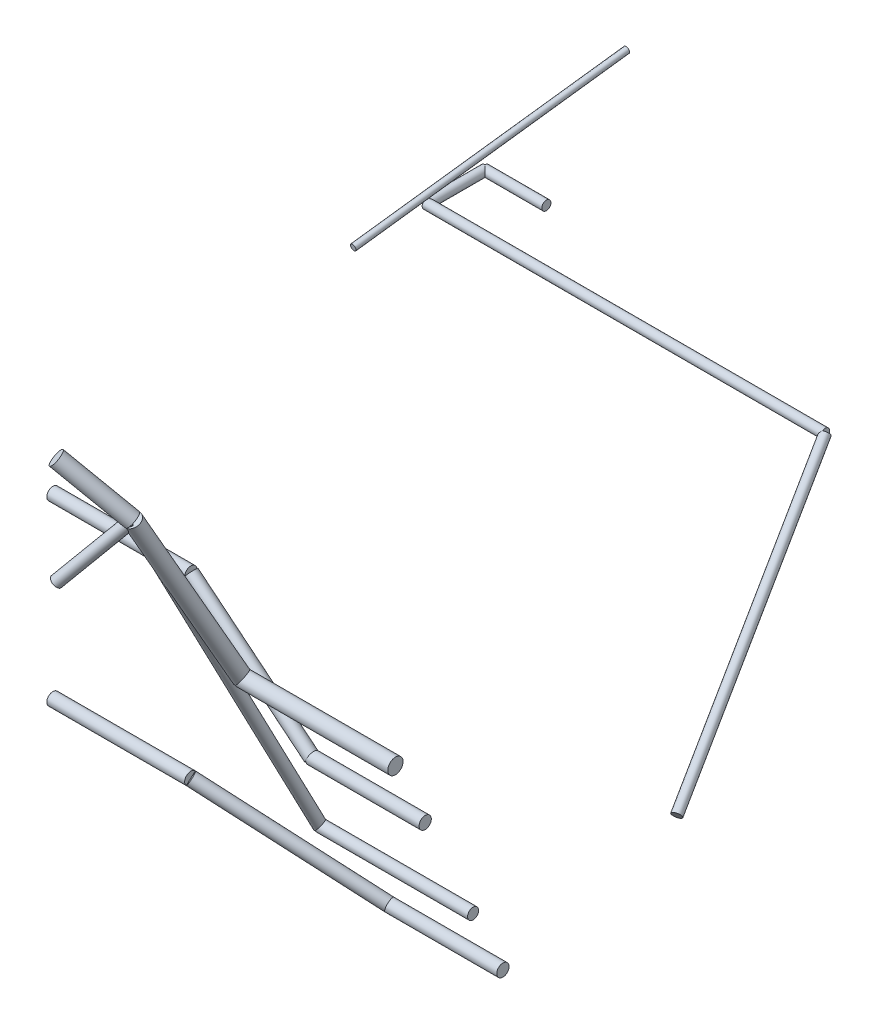
ISO-10303-21;
HEADER;
FILE_DESCRIPTION(('STEP AP214'),'2;1');
FILE_NAME('part.step','',(''),(''),'','','');
FILE_SCHEMA(('AUTOMOTIVE_DESIGN { 1 0 10303 214 1 1 1 1 }'));
ENDSEC;
DATA;
#1=APPLICATION_CONTEXT('core data for automotive mechanical design processes');
#2=APPLICATION_PROTOCOL_DEFINITION('international standard','automotive_design',2000,#1);
#3=PRODUCT_CONTEXT('',#1,'mechanical');
#4=PRODUCT('Part','Part','',(#3));
#5=PRODUCT_RELATED_PRODUCT_CATEGORY('part','',(#4));
#6=PRODUCT_DEFINITION_FORMATION('','',#4);
#7=PRODUCT_DEFINITION_CONTEXT('part definition',#1,'design');
#8=PRODUCT_DEFINITION('design','',#6,#7);
#9=PRODUCT_DEFINITION_SHAPE('','',#8);
#10=(LENGTH_UNIT() NAMED_UNIT(*) SI_UNIT(.MILLI.,.METRE.));
#11=(NAMED_UNIT(*) PLANE_ANGLE_UNIT() SI_UNIT($,.RADIAN.));
#12=(NAMED_UNIT(*) SI_UNIT($,.STERADIAN.) SOLID_ANGLE_UNIT());
#13=UNCERTAINTY_MEASURE_WITH_UNIT(LENGTH_MEASURE(1.E-05),#10,'distance_accuracy_value','');
#14=(GEOMETRIC_REPRESENTATION_CONTEXT(3) GLOBAL_UNCERTAINTY_ASSIGNED_CONTEXT((#13)) GLOBAL_UNIT_ASSIGNED_CONTEXT((#10,
#11,#12)) REPRESENTATION_CONTEXT('',''));
#15=CARTESIAN_POINT('',(0.,0.,0.));
#16=DIRECTION('',(0.,0.,1.));
#17=DIRECTION('',(1.,0.,0.));
#18=AXIS2_PLACEMENT_3D('',#15,#16,#17);
#19=CARTESIAN_POINT('',(-98.,-66.4208,82.229));
#20=DIRECTION('',(-1.,0.,0.));
#21=DIRECTION('',(0.,0.,1.));
#22=AXIS2_PLACEMENT_3D('',#19,#20,#21);
#23=PLANE('',#22);
#24=CARTESIAN_POINT('',(-98.,-66.4208,82.229));
#25=DIRECTION('',(1.,0.,0.));
#26=DIRECTION('',(0.,0.,-1.));
#27=AXIS2_PLACEMENT_3D('',#24,#25,#26);
#28=CIRCLE('',#27,2.5);
#29=CARTESIAN_POINT('',(-98.,-66.4208,79.729));
#30=VERTEX_POINT('',#29);
#31=EDGE_CURVE('P0_E10',#30,#30,#28,.T.);
#32=ORIENTED_EDGE('',*,*,#31,.F.);
#33=EDGE_LOOP('',(#32));
#34=FACE_BOUND('',#33,.T.);
#35=ADVANCED_FACE('P0_F15',(#34),#23,.T.);
#36=CARTESIAN_POINT('',(-48.,-66.4208,82.229));
#37=DIRECTION('',(1.,0.,0.));
#38=DIRECTION('',(0.,0.,-1.));
#39=AXIS2_PLACEMENT_3D('',#36,#37,#38);
#40=PLANE('',#39);
#41=CARTESIAN_POINT('',(-48.,-66.4208,82.229));
#42=DIRECTION('',(-1.,0.,0.));
#43=DIRECTION('',(0.,0.,1.));
#44=AXIS2_PLACEMENT_3D('',#41,#42,#43);
#45=CIRCLE('',#44,2.5);
#46=CARTESIAN_POINT('',(-48.,-66.4208,84.729));
#47=VERTEX_POINT('',#46);
#48=EDGE_CURVE('P0_E22',#47,#47,#45,.T.);
#49=ORIENTED_EDGE('',*,*,#48,.F.);
#50=EDGE_LOOP('',(#49));
#51=FACE_BOUND('',#50,.T.);
#52=ADVANCED_FACE('P0_F26',(#51),#40,.T.);
#53=CARTESIAN_POINT('',(-48.,-66.4208,82.229));
#54=DIRECTION('',(-1.,0.,0.));
#55=DIRECTION('',(0.,0.,1.));
#56=AXIS2_PLACEMENT_3D('',#53,#54,#55);
#57=CYLINDRICAL_SURFACE('',#56,2.5);
#58=ORIENTED_EDGE('',*,*,#31,.T.);
#59=EDGE_LOOP('',(#58));
#60=FACE_BOUND('',#59,.T.);
#61=ORIENTED_EDGE('',*,*,#48,.T.);
#62=EDGE_LOOP('',(#61));
#63=FACE_BOUND('',#62,.T.);
#64=ADVANCED_FACE('P0_F17',(#60,#63),#57,.T.);
#65=CLOSED_SHELL('',(#35,#52,#64));
#66=MANIFOLD_SOLID_BREP('P0_B1',#65);
#67=CARTESIAN_POINT('',(-104.,-10.,112.));
#68=DIRECTION('',(-0.0936401114906505,0.880541667065283,0.46462662653136));
#69=DIRECTION('',(0.,-0.466677153849027,0.884427743840825));
#70=AXIS2_PLACEMENT_3D('',#67,#68,#69);
#71=PLANE('',#70);
#72=CARTESIAN_POINT('',(-104.,-10.,112.));
#73=DIRECTION('',(0.0936401114906505,-0.880541667065283,-0.46462662653136));
#74=DIRECTION('',(0.,0.466677153849027,-0.884427743840825));
#75=AXIS2_PLACEMENT_3D('',#72,#73,#74);
#76=CIRCLE('',#75,2.5);
#77=CARTESIAN_POINT('',(-104.,-8.83330711537744,109.788930640398));
#78=VERTEX_POINT('',#77);
#79=EDGE_CURVE('P1_E10',#78,#78,#76,.T.);
#80=ORIENTED_EDGE('',*,*,#79,.F.);
#81=EDGE_LOOP('',(#80));
#82=FACE_BOUND('',#81,.T.);
#83=ADVANCED_FACE('P1_F15',(#82),#71,.T.);
#84=CARTESIAN_POINT('',(-98.,-66.4208,82.229));
#85=DIRECTION('',(0.0936401114906505,-0.880541667065283,-0.46462662653136));
#86=DIRECTION('',(0.,0.466677153849027,-0.884427743840825));
#87=AXIS2_PLACEMENT_3D('',#84,#85,#86);
#88=PLANE('',#87);
#89=CARTESIAN_POINT('',(-98.,-66.4208,82.229));
#90=DIRECTION('',(-0.0936401114906505,0.880541667065283,0.46462662653136));
#91=DIRECTION('',(0.,-0.466677153849027,0.884427743840825));
#92=AXIS2_PLACEMENT_3D('',#89,#90,#91);
#93=CIRCLE('',#92,2.5);
#94=CARTESIAN_POINT('',(-98.,-67.5874928846226,84.4400693596021));
#95=VERTEX_POINT('',#94);
#96=EDGE_CURVE('P1_E22',#95,#95,#93,.T.);
#97=ORIENTED_EDGE('',*,*,#96,.F.);
#98=EDGE_LOOP('',(#97));
#99=FACE_BOUND('',#98,.T.);
#100=ADVANCED_FACE('P1_F26',(#99),#88,.T.);
#101=CARTESIAN_POINT('',(-98.,-66.4208,82.229));
#102=DIRECTION('',(-0.0936401114906505,0.880541667065283,0.46462662653136));
#103=DIRECTION('',(0.,-0.466677153849027,0.884427743840825));
#104=AXIS2_PLACEMENT_3D('',#101,#102,#103);
#105=CYLINDRICAL_SURFACE('',#104,2.5);
#106=ORIENTED_EDGE('',*,*,#79,.T.);
#107=EDGE_LOOP('',(#106));
#108=FACE_BOUND('',#107,.T.);
#109=ORIENTED_EDGE('',*,*,#96,.T.);
#110=EDGE_LOOP('',(#109));
#111=FACE_BOUND('',#110,.T.);
#112=ADVANCED_FACE('P1_F17',(#108,#111),#105,.T.);
#113=CLOSED_SHELL('',(#83,#100,#112));
#114=MANIFOLD_SOLID_BREP('P1_B1',#113);
#115=CARTESIAN_POINT('',(-119.,5.,121.9));
#116=DIRECTION('',(-0.640762396942007,0.640762396942007,0.422903181981725));
#117=DIRECTION('',(-0.707106781186548,-0.707106781186548,0.));
#118=AXIS2_PLACEMENT_3D('',#115,#116,#117);
#119=PLANE('',#118);
#120=CARTESIAN_POINT('',(-119.,5.,121.9));
#121=DIRECTION('',(0.640762396942007,-0.640762396942007,-0.422903181981725));
#122=DIRECTION('',(0.707106781186548,0.707106781186548,0.));
#123=AXIS2_PLACEMENT_3D('',#120,#121,#122);
#124=CIRCLE('',#123,2.5);
#125=CARTESIAN_POINT('',(-117.232233047034,6.76776695296637,121.9));
#126=VERTEX_POINT('',#125);
#127=EDGE_CURVE('P2_E10',#126,#126,#124,.T.);
#128=ORIENTED_EDGE('',*,*,#127,.F.);
#129=EDGE_LOOP('',(#128));
#130=FACE_BOUND('',#129,.T.);
#131=ADVANCED_FACE('P2_F15',(#130),#119,.T.);
#132=CARTESIAN_POINT('',(-104.,-10.,112.));
#133=DIRECTION('',(0.640762396942007,-0.640762396942007,-0.422903181981725));
#134=DIRECTION('',(0.707106781186548,0.707106781186548,0.));
#135=AXIS2_PLACEMENT_3D('',#132,#133,#134);
#136=PLANE('',#135);
#137=CARTESIAN_POINT('',(-104.,-10.,112.));
#138=DIRECTION('',(-0.640762396942007,0.640762396942007,0.422903181981725));
#139=DIRECTION('',(-0.707106781186548,-0.707106781186548,0.));
#140=AXIS2_PLACEMENT_3D('',#137,#138,#139);
#141=CIRCLE('',#140,2.5);
#142=CARTESIAN_POINT('',(-105.767766952966,-11.7677669529664,112.));
#143=VERTEX_POINT('',#142);
#144=EDGE_CURVE('P2_E22',#143,#143,#141,.T.);
#145=ORIENTED_EDGE('',*,*,#144,.F.);
#146=EDGE_LOOP('',(#145));
#147=FACE_BOUND('',#146,.T.);
#148=ADVANCED_FACE('P2_F26',(#147),#136,.T.);
#149=CARTESIAN_POINT('',(-104.,-10.,112.));
#150=DIRECTION('',(-0.640762396942007,0.640762396942007,0.422903181981725));
#151=DIRECTION('',(-0.707106781186548,-0.707106781186548,0.));
#152=AXIS2_PLACEMENT_3D('',#149,#150,#151);
#153=CYLINDRICAL_SURFACE('',#152,2.5);
#154=ORIENTED_EDGE('',*,*,#127,.T.);
#155=EDGE_LOOP('',(#154));
#156=FACE_BOUND('',#155,.T.);
#157=ORIENTED_EDGE('',*,*,#144,.T.);
#158=EDGE_LOOP('',(#157));
#159=FACE_BOUND('',#158,.T.);
#160=ADVANCED_FACE('P2_F17',(#156,#159),#153,.T.);
#161=CLOSED_SHELL('',(#131,#148,#160));
#162=MANIFOLD_SOLID_BREP('P2_B1',#161);
#163=CARTESIAN_POINT('',(-98.,-120.7992,56.8719));
#164=DIRECTION('',(-1.,0.,0.));
#165=DIRECTION('',(0.,0.,1.));
#166=AXIS2_PLACEMENT_3D('',#163,#164,#165);
#167=PLANE('',#166);
#168=CARTESIAN_POINT('',(-98.,-120.7992,56.8719));
#169=DIRECTION('',(1.,0.,0.));
#170=DIRECTION('',(0.,0.,-1.));
#171=AXIS2_PLACEMENT_3D('',#168,#169,#170);
#172=CIRCLE('',#171,1.8);
#173=CARTESIAN_POINT('',(-98.,-120.7992,55.0719));
#174=VERTEX_POINT('',#173);
#175=EDGE_CURVE('P3_E10',#174,#174,#172,.T.);
#176=ORIENTED_EDGE('',*,*,#175,.F.);
#177=EDGE_LOOP('',(#176));
#178=FACE_BOUND('',#177,.T.);
#179=ADVANCED_FACE('P3_F15',(#178),#167,.T.);
#180=CARTESIAN_POINT('',(-48.,-120.7992,56.8719));
#181=DIRECTION('',(1.,0.,0.));
#182=DIRECTION('',(0.,0.,-1.));
#183=AXIS2_PLACEMENT_3D('',#180,#181,#182);
#184=PLANE('',#183);
#185=CARTESIAN_POINT('',(-48.,-120.7992,56.8719));
#186=DIRECTION('',(-1.,0.,0.));
#187=DIRECTION('',(0.,0.,1.));
#188=AXIS2_PLACEMENT_3D('',#185,#186,#187);
#189=CIRCLE('',#188,1.8);
#190=CARTESIAN_POINT('',(-48.,-120.7992,58.6719));
#191=VERTEX_POINT('',#190);
#192=EDGE_CURVE('P3_E22',#191,#191,#189,.T.);
#193=ORIENTED_EDGE('',*,*,#192,.F.);
#194=EDGE_LOOP('',(#193));
#195=FACE_BOUND('',#194,.T.);
#196=ADVANCED_FACE('P3_F26',(#195),#184,.T.);
#197=CARTESIAN_POINT('',(-48.,-120.7992,56.8719));
#198=DIRECTION('',(-1.,0.,0.));
#199=DIRECTION('',(0.,0.,1.));
#200=AXIS2_PLACEMENT_3D('',#197,#198,#199);
#201=CYLINDRICAL_SURFACE('',#200,1.8);
#202=ORIENTED_EDGE('',*,*,#175,.T.);
#203=EDGE_LOOP('',(#202));
#204=FACE_BOUND('',#203,.T.);
#205=ORIENTED_EDGE('',*,*,#192,.T.);
#206=EDGE_LOOP('',(#205));
#207=FACE_BOUND('',#206,.T.);
#208=ADVANCED_FACE('P3_F17',(#204,#207),#201,.T.);
#209=CLOSED_SHELL('',(#179,#196,#208));
#210=MANIFOLD_SOLID_BREP('P3_B1',#209);
#211=CARTESIAN_POINT('',(-104.,-9.99999999999999,112.));
#212=DIRECTION('',(-0.0484255821067293,0.894252626159987,0.444935055489664));
#213=DIRECTION('',(0.,-0.445457669415632,0.895303001647372));
#214=AXIS2_PLACEMENT_3D('',#211,#212,#213);
#215=PLANE('',#214);
#216=CARTESIAN_POINT('',(-104.,-9.99999999999999,112.));
#217=DIRECTION('',(0.0484255821067293,-0.894252626159987,-0.444935055489664));
#218=DIRECTION('',(0.,0.445457669415632,-0.895303001647372));
#219=AXIS2_PLACEMENT_3D('',#216,#217,#218);
#220=CIRCLE('',#219,1.8);
#221=CARTESIAN_POINT('',(-104.,-9.19817619505186,110.388454597035));
#222=VERTEX_POINT('',#221);
#223=EDGE_CURVE('P4_E10',#222,#222,#220,.T.);
#224=ORIENTED_EDGE('',*,*,#223,.F.);
#225=EDGE_LOOP('',(#224));
#226=FACE_BOUND('',#225,.T.);
#227=ADVANCED_FACE('P4_F15',(#226),#215,.T.);
#228=CARTESIAN_POINT('',(-98.,-120.7992,56.8719));
#229=DIRECTION('',(0.0484255821067293,-0.894252626159987,-0.444935055489664));
#230=DIRECTION('',(0.,0.445457669415632,-0.895303001647372));
#231=AXIS2_PLACEMENT_3D('',#228,#229,#230);
#232=PLANE('',#231);
#233=CARTESIAN_POINT('',(-98.,-120.7992,56.8719));
#234=DIRECTION('',(-0.0484255821067293,0.894252626159987,0.444935055489664));
#235=DIRECTION('',(0.,-0.445457669415632,0.895303001647372));
#236=AXIS2_PLACEMENT_3D('',#233,#234,#235);
#237=CIRCLE('',#236,1.8);
#238=CARTESIAN_POINT('',(-98.,-121.601023804948,58.4834454029653));
#239=VERTEX_POINT('',#238);
#240=EDGE_CURVE('P4_E22',#239,#239,#237,.T.);
#241=ORIENTED_EDGE('',*,*,#240,.F.);
#242=EDGE_LOOP('',(#241));
#243=FACE_BOUND('',#242,.T.);
#244=ADVANCED_FACE('P4_F26',(#243),#232,.T.);
#245=CARTESIAN_POINT('',(-98.,-120.7992,56.8719));
#246=DIRECTION('',(-0.0484255821067293,0.894252626159987,0.444935055489664));
#247=DIRECTION('',(0.,-0.445457669415632,0.895303001647372));
#248=AXIS2_PLACEMENT_3D('',#245,#246,#247);
#249=CYLINDRICAL_SURFACE('',#248,1.8);
#250=ORIENTED_EDGE('',*,*,#223,.T.);
#251=EDGE_LOOP('',(#250));
#252=FACE_BOUND('',#251,.T.);
#253=ORIENTED_EDGE('',*,*,#240,.T.);
#254=EDGE_LOOP('',(#253));
#255=FACE_BOUND('',#254,.T.);
#256=ADVANCED_FACE('P4_F17',(#252,#255),#249,.T.);
#257=CLOSED_SHELL('',(#227,#244,#256));
#258=MANIFOLD_SOLID_BREP('P4_B1',#257);
#259=CARTESIAN_POINT('',(-119.,-30.,121.9));
#260=DIRECTION('',(-0.557852144593892,-0.743802859458523,0.368182415431969));
#261=DIRECTION('',(0.8,-0.6,0.));
#262=AXIS2_PLACEMENT_3D('',#259,#260,#261);
#263=PLANE('',#262);
#264=CARTESIAN_POINT('',(-119.,-30.,121.9));
#265=DIRECTION('',(0.557852144593892,0.743802859458523,-0.368182415431969));
#266=DIRECTION('',(-0.8,0.6,0.));
#267=AXIS2_PLACEMENT_3D('',#264,#265,#266);
#268=CIRCLE('',#267,1.8);
#269=CARTESIAN_POINT('',(-120.44,-28.92,121.9));
#270=VERTEX_POINT('',#269);
#271=EDGE_CURVE('P5_E10',#270,#270,#268,.T.);
#272=ORIENTED_EDGE('',*,*,#271,.F.);
#273=EDGE_LOOP('',(#272));
#274=FACE_BOUND('',#273,.T.);
#275=ADVANCED_FACE('P5_F15',(#274),#263,.T.);
#276=CARTESIAN_POINT('',(-104.,-10.,112.));
#277=DIRECTION('',(0.557852144593892,0.743802859458523,-0.368182415431969));
#278=DIRECTION('',(-0.8,0.6,0.));
#279=AXIS2_PLACEMENT_3D('',#276,#277,#278);
#280=PLANE('',#279);
#281=CARTESIAN_POINT('',(-104.,-10.,112.));
#282=DIRECTION('',(-0.557852144593892,-0.743802859458523,0.368182415431969));
#283=DIRECTION('',(0.8,-0.6,0.));
#284=AXIS2_PLACEMENT_3D('',#281,#282,#283);
#285=CIRCLE('',#284,1.8);
#286=CARTESIAN_POINT('',(-102.56,-11.08,112.));
#287=VERTEX_POINT('',#286);
#288=EDGE_CURVE('P5_E22',#287,#287,#285,.T.);
#289=ORIENTED_EDGE('',*,*,#288,.F.);
#290=EDGE_LOOP('',(#289));
#291=FACE_BOUND('',#290,.T.);
#292=ADVANCED_FACE('P5_F26',(#291),#280,.T.);
#293=CARTESIAN_POINT('',(-104.,-10.,112.));
#294=DIRECTION('',(-0.557852144593892,-0.743802859458523,0.368182415431969));
#295=DIRECTION('',(0.8,-0.6,0.));
#296=AXIS2_PLACEMENT_3D('',#293,#294,#295);
#297=CYLINDRICAL_SURFACE('',#296,1.8);
#298=ORIENTED_EDGE('',*,*,#271,.T.);
#299=EDGE_LOOP('',(#298));
#300=FACE_BOUND('',#299,.T.);
#301=ORIENTED_EDGE('',*,*,#288,.T.);
#302=EDGE_LOOP('',(#301));
#303=FACE_BOUND('',#302,.T.);
#304=ADVANCED_FACE('P5_F17',(#300,#303),#297,.T.);
#305=CLOSED_SHELL('',(#275,#292,#304));
#306=MANIFOLD_SOLID_BREP('P5_B1',#305);
#307=CARTESIAN_POINT('',(-65.,70.4055,36.));
#308=DIRECTION('',(-1.,0.,0.));
#309=DIRECTION('',(0.,0.,1.));
#310=AXIS2_PLACEMENT_3D('',#307,#308,#309);
#311=PLANE('',#310);
#312=CARTESIAN_POINT('',(-65.,70.4055,36.));
#313=DIRECTION('',(1.,0.,0.));
#314=DIRECTION('',(0.,0.,-1.));
#315=AXIS2_PLACEMENT_3D('',#312,#313,#314);
#316=CIRCLE('',#315,1.5);
#317=CARTESIAN_POINT('',(-65.,70.4055,34.5));
#318=VERTEX_POINT('',#317);
#319=EDGE_CURVE('P6_E10',#318,#318,#316,.T.);
#320=ORIENTED_EDGE('',*,*,#319,.F.);
#321=EDGE_LOOP('',(#320));
#322=FACE_BOUND('',#321,.T.);
#323=ADVANCED_FACE('P6_F15',(#322),#311,.T.);
#324=CARTESIAN_POINT('',(-44.972,70.4055,36.));
#325=DIRECTION('',(1.,0.,0.));
#326=DIRECTION('',(0.,0.,-1.));
#327=AXIS2_PLACEMENT_3D('',#324,#325,#326);
#328=PLANE('',#327);
#329=CARTESIAN_POINT('',(-44.972,70.4055,36.));
#330=DIRECTION('',(-1.,0.,0.));
#331=DIRECTION('',(0.,0.,1.));
#332=AXIS2_PLACEMENT_3D('',#329,#330,#331);
#333=CIRCLE('',#332,1.5);
#334=CARTESIAN_POINT('',(-44.972,70.4055,37.5));
#335=VERTEX_POINT('',#334);
#336=EDGE_CURVE('P6_E22',#335,#335,#333,.T.);
#337=ORIENTED_EDGE('',*,*,#336,.F.);
#338=EDGE_LOOP('',(#337));
#339=FACE_BOUND('',#338,.T.);
#340=ADVANCED_FACE('P6_F26',(#339),#328,.T.);
#341=CARTESIAN_POINT('',(-44.972,70.4055,36.));
#342=DIRECTION('',(-1.,0.,0.));
#343=DIRECTION('',(0.,0.,1.));
#344=AXIS2_PLACEMENT_3D('',#341,#342,#343);
#345=CYLINDRICAL_SURFACE('',#344,1.5);
#346=ORIENTED_EDGE('',*,*,#319,.T.);
#347=EDGE_LOOP('',(#346));
#348=FACE_BOUND('',#347,.T.);
#349=ORIENTED_EDGE('',*,*,#336,.T.);
#350=EDGE_LOOP('',(#349));
#351=FACE_BOUND('',#350,.T.);
#352=ADVANCED_FACE('P6_F17',(#348,#351),#345,.T.);
#353=CLOSED_SHELL('',(#323,#340,#352));
#354=MANIFOLD_SOLID_BREP('P6_B1',#353);
#355=CARTESIAN_POINT('',(-65.,70.4055,55.));
#356=DIRECTION('',(0.,0.,1.));
#357=DIRECTION('',(1.,0.,0.));
#358=AXIS2_PLACEMENT_3D('',#355,#356,#357);
#359=PLANE('',#358);
#360=CARTESIAN_POINT('',(-65.,70.4055,55.));
#361=DIRECTION('',(0.,0.,-1.));
#362=DIRECTION('',(-1.,0.,0.));
#363=AXIS2_PLACEMENT_3D('',#360,#361,#362);
#364=CIRCLE('',#363,1.5);
#365=CARTESIAN_POINT('',(-66.5,70.4055,55.));
#366=VERTEX_POINT('',#365);
#367=EDGE_CURVE('P7_E10',#366,#366,#364,.T.);
#368=ORIENTED_EDGE('',*,*,#367,.F.);
#369=EDGE_LOOP('',(#368));
#370=FACE_BOUND('',#369,.T.);
#371=ADVANCED_FACE('P7_F15',(#370),#359,.T.);
#372=CARTESIAN_POINT('',(-65.,70.4055,36.));
#373=DIRECTION('',(0.,0.,-1.));
#374=DIRECTION('',(-1.,0.,0.));
#375=AXIS2_PLACEMENT_3D('',#372,#373,#374);
#376=PLANE('',#375);
#377=CARTESIAN_POINT('',(-65.,70.4055,36.));
#378=DIRECTION('',(0.,0.,1.));
#379=DIRECTION('',(1.,0.,0.));
#380=AXIS2_PLACEMENT_3D('',#377,#378,#379);
#381=CIRCLE('',#380,1.5);
#382=CARTESIAN_POINT('',(-63.5,70.4055,36.));
#383=VERTEX_POINT('',#382);
#384=EDGE_CURVE('P7_E22',#383,#383,#381,.T.);
#385=ORIENTED_EDGE('',*,*,#384,.F.);
#386=EDGE_LOOP('',(#385));
#387=FACE_BOUND('',#386,.T.);
#388=ADVANCED_FACE('P7_F26',(#387),#376,.T.);
#389=CARTESIAN_POINT('',(-65.,70.4055,36.));
#390=DIRECTION('',(0.,0.,1.));
#391=DIRECTION('',(1.,0.,0.));
#392=AXIS2_PLACEMENT_3D('',#389,#390,#391);
#393=CYLINDRICAL_SURFACE('',#392,1.5);
#394=ORIENTED_EDGE('',*,*,#367,.T.);
#395=EDGE_LOOP('',(#394));
#396=FACE_BOUND('',#395,.T.);
#397=ORIENTED_EDGE('',*,*,#384,.T.);
#398=EDGE_LOOP('',(#397));
#399=FACE_BOUND('',#398,.T.);
#400=ADVANCED_FACE('P7_F17',(#396,#399),#393,.T.);
#401=CLOSED_SHELL('',(#371,#388,#400));
#402=MANIFOLD_SOLID_BREP('P7_B1',#401);
#403=CARTESIAN_POINT('',(65.,70.4055,55.));
#404=DIRECTION('',(1.,0.,0.));
#405=DIRECTION('',(0.,0.,-1.));
#406=AXIS2_PLACEMENT_3D('',#403,#404,#405);
#407=PLANE('',#406);
#408=CARTESIAN_POINT('',(65.,70.4055,55.));
#409=DIRECTION('',(-1.,0.,0.));
#410=DIRECTION('',(0.,0.,1.));
#411=AXIS2_PLACEMENT_3D('',#408,#409,#410);
#412=CIRCLE('',#411,1.5);
#413=CARTESIAN_POINT('',(65.,70.4055,56.5));
#414=VERTEX_POINT('',#413);
#415=EDGE_CURVE('P8_E10',#414,#414,#412,.T.);
#416=ORIENTED_EDGE('',*,*,#415,.F.);
#417=EDGE_LOOP('',(#416));
#418=FACE_BOUND('',#417,.T.);
#419=ADVANCED_FACE('P8_F15',(#418),#407,.T.);
#420=CARTESIAN_POINT('',(-65.,70.4055,55.));
#421=DIRECTION('',(-1.,0.,0.));
#422=DIRECTION('',(0.,0.,1.));
#423=AXIS2_PLACEMENT_3D('',#420,#421,#422);
#424=PLANE('',#423);
#425=CARTESIAN_POINT('',(-65.,70.4055,55.));
#426=DIRECTION('',(1.,0.,0.));
#427=DIRECTION('',(0.,0.,-1.));
#428=AXIS2_PLACEMENT_3D('',#425,#426,#427);
#429=CIRCLE('',#428,1.5);
#430=CARTESIAN_POINT('',(-65.,70.4055,53.5));
#431=VERTEX_POINT('',#430);
#432=EDGE_CURVE('P8_E22',#431,#431,#429,.T.);
#433=ORIENTED_EDGE('',*,*,#432,.F.);
#434=EDGE_LOOP('',(#433));
#435=FACE_BOUND('',#434,.T.);
#436=ADVANCED_FACE('P8_F26',(#435),#424,.T.);
#437=CARTESIAN_POINT('',(-65.,70.4055,55.));
#438=DIRECTION('',(1.,0.,0.));
#439=DIRECTION('',(0.,0.,-1.));
#440=AXIS2_PLACEMENT_3D('',#437,#438,#439);
#441=CYLINDRICAL_SURFACE('',#440,1.5);
#442=ORIENTED_EDGE('',*,*,#415,.T.);
#443=EDGE_LOOP('',(#442));
#444=FACE_BOUND('',#443,.T.);
#445=ORIENTED_EDGE('',*,*,#432,.T.);
#446=EDGE_LOOP('',(#445));
#447=FACE_BOUND('',#446,.T.);
#448=ADVANCED_FACE('P8_F17',(#444,#447),#441,.T.);
#449=CLOSED_SHELL('',(#419,#436,#448));
#450=MANIFOLD_SOLID_BREP('P8_B1',#449);
#451=CARTESIAN_POINT('',(95.,16.717,133.4));
#452=DIRECTION('',(0.301070476982569,-0.538800743449288,0.786797513181113));
#453=DIRECTION('',(0.,-0.825079648031157,-0.565016437287255));
#454=AXIS2_PLACEMENT_3D('',#451,#452,#453);
#455=PLANE('',#454);
#456=CARTESIAN_POINT('',(95.,16.717,133.4));
#457=DIRECTION('',(-0.301070476982569,0.538800743449288,-0.786797513181113));
#458=DIRECTION('',(0.,0.825079648031157,0.565016437287255));
#459=AXIS2_PLACEMENT_3D('',#456,#457,#458);
#460=CIRCLE('',#459,1.5);
#461=CARTESIAN_POINT('',(95.,17.9546194720467,134.247524655931));
#462=VERTEX_POINT('',#461);
#463=EDGE_CURVE('P9_E10',#462,#462,#460,.T.);
#464=ORIENTED_EDGE('',*,*,#463,.F.);
#465=EDGE_LOOP('',(#464));
#466=FACE_BOUND('',#465,.T.);
#467=ADVANCED_FACE('P9_F15',(#466),#455,.T.);
#468=CARTESIAN_POINT('',(65.,70.4055,55.));
#469=DIRECTION('',(-0.301070476982569,0.538800743449288,-0.786797513181113));
#470=DIRECTION('',(0.,0.825079648031157,0.565016437287255));
#471=AXIS2_PLACEMENT_3D('',#468,#469,#470);
#472=PLANE('',#471);
#473=CARTESIAN_POINT('',(65.,70.4055,55.));
#474=DIRECTION('',(0.301070476982569,-0.538800743449288,0.786797513181113));
#475=DIRECTION('',(0.,-0.825079648031157,-0.565016437287255));
#476=AXIS2_PLACEMENT_3D('',#473,#474,#475);
#477=CIRCLE('',#476,1.5);
#478=CARTESIAN_POINT('',(65.,69.1678805279533,54.1524753440691));
#479=VERTEX_POINT('',#478);
#480=EDGE_CURVE('P9_E22',#479,#479,#477,.T.);
#481=ORIENTED_EDGE('',*,*,#480,.F.);
#482=EDGE_LOOP('',(#481));
#483=FACE_BOUND('',#482,.T.);
#484=ADVANCED_FACE('P9_F26',(#483),#472,.T.);
#485=CARTESIAN_POINT('',(65.,70.4055,55.));
#486=DIRECTION('',(0.301070476982569,-0.538800743449288,0.786797513181113));
#487=DIRECTION('',(0.,-0.825079648031157,-0.565016437287255));
#488=AXIS2_PLACEMENT_3D('',#485,#486,#487);
#489=CYLINDRICAL_SURFACE('',#488,1.5);
#490=ORIENTED_EDGE('',*,*,#463,.T.);
#491=EDGE_LOOP('',(#490));
#492=FACE_BOUND('',#491,.T.);
#493=ORIENTED_EDGE('',*,*,#480,.T.);
#494=EDGE_LOOP('',(#493));
#495=FACE_BOUND('',#494,.T.);
#496=ADVANCED_FACE('P9_F17',(#492,#495),#489,.T.);
#497=CLOSED_SHELL('',(#467,#484,#496));
#498=MANIFOLD_SOLID_BREP('P9_B1',#497);
#499=CARTESIAN_POINT('',(-25.,110.,119.));
#500=DIRECTION('',(-0.0739691676467034,-0.206361340967482,0.975675949888976));
#501=DIRECTION('',(0.,-0.978356128357743,-0.206928214859279));
#502=AXIS2_PLACEMENT_3D('',#499,#500,#501);
#503=PLANE('',#502);
#504=CARTESIAN_POINT('',(-25.,110.,119.));
#505=DIRECTION('',(0.0739691676467034,0.206361340967482,-0.975675949888976));
#506=DIRECTION('',(0.,0.978356128357743,0.206928214859279));
#507=AXIS2_PLACEMENT_3D('',#504,#505,#506);
#508=CIRCLE('',#507,1.);
#509=CARTESIAN_POINT('',(-25.,109.021643871642,118.793071785141));
#510=VERTEX_POINT('',#509);
#511=EDGE_CURVE('P10_E10',#510,#510,#508,.T.);
#512=ORIENTED_EDGE('',*,*,#511,.F.);
#513=EDGE_LOOP('',(#512));
#514=FACE_BOUND('',#513,.T.);
#515=ADVANCED_FACE('P10_F15',(#514),#503,.T.);
#516=CARTESIAN_POINT('',(-18.7075,127.555,36.));
#517=DIRECTION('',(0.0739691676467034,0.206361340967482,-0.975675949888976));
#518=DIRECTION('',(0.,0.978356128357743,0.206928214859279));
#519=AXIS2_PLACEMENT_3D('',#516,#517,#518);
#520=PLANE('',#519);
#521=CARTESIAN_POINT('',(-18.7075,127.555,36.));
#522=DIRECTION('',(-0.0739691676467034,-0.206361340967482,0.975675949888976));
#523=DIRECTION('',(0.,-0.978356128357743,-0.206928214859279));
#524=AXIS2_PLACEMENT_3D('',#521,#522,#523);
#525=CIRCLE('',#524,1.);
#526=CARTESIAN_POINT('',(-18.7075,126.576643871642,35.7930717851407));
#527=VERTEX_POINT('',#526);
#528=EDGE_CURVE('P10_E22',#527,#527,#525,.T.);
#529=ORIENTED_EDGE('',*,*,#528,.F.);
#530=EDGE_LOOP('',(#529));
#531=FACE_BOUND('',#530,.T.);
#532=ADVANCED_FACE('P10_F26',(#531),#520,.T.);
#533=CARTESIAN_POINT('',(-18.7075,127.555,36.));
#534=DIRECTION('',(-0.0739691676467034,-0.206361340967482,0.975675949888976));
#535=DIRECTION('',(0.,-0.978356128357743,-0.206928214859279));
#536=AXIS2_PLACEMENT_3D('',#533,#534,#535);
#537=CYLINDRICAL_SURFACE('',#536,1.);
#538=CARTESIAN_POINT('',(-25.,109.021643871642,118.793071785141));
#539=CARTESIAN_POINT('',(-24.934453125,109.204508454976,117.928488451807));
#540=CARTESIAN_POINT('',(-24.86890625,109.387373038309,117.063905118474));
#541=CARTESIAN_POINT('',(-24.7378125,109.753102204976,115.334738451807));
#542=CARTESIAN_POINT('',(-24.672265625,109.935966788309,114.470155118474));
#543=CARTESIAN_POINT('',(-24.541171875,110.301695954976,112.740988451807));
#544=CARTESIAN_POINT('',(-24.475625,110.484560538309,111.876405118474));
#545=CARTESIAN_POINT('',(-24.34453125,110.850289704976,110.147238451807));
#546=CARTESIAN_POINT('',(-24.278984375,111.033154288309,109.282655118474));
#547=CARTESIAN_POINT('',(-24.147890625,111.398883454976,107.553488451807));
#548=CARTESIAN_POINT('',(-24.08234375,111.581748038309,106.688905118474));
#549=CARTESIAN_POINT('',(-23.95125,111.947477204976,104.959738451807));
#550=CARTESIAN_POINT('',(-23.885703125,112.130341788309,104.095155118474));
#551=CARTESIAN_POINT('',(-23.754609375,112.496070954976,102.365988451807));
#552=CARTESIAN_POINT('',(-23.6890625,112.678935538309,101.501405118474));
#553=CARTESIAN_POINT('',(-23.55796875,113.044664704976,99.7722384518074));
#554=CARTESIAN_POINT('',(-23.492421875,113.227529288309,98.9076551184741));
#555=CARTESIAN_POINT('',(-23.361328125,113.593258454976,97.1784884518074));
#556=CARTESIAN_POINT('',(-23.29578125,113.776123038309,96.313905118474));
#557=CARTESIAN_POINT('',(-23.1646875,114.141852204976,94.5847384518074));
#558=CARTESIAN_POINT('',(-23.099140625,114.324716788309,93.720155118474));
#559=CARTESIAN_POINT('',(-22.968046875,114.690445954976,91.9909884518074));
#560=CARTESIAN_POINT('',(-22.9025,114.873310538309,91.126405118474));
#561=CARTESIAN_POINT('',(-22.77140625,115.239039704976,89.3972384518074));
#562=CARTESIAN_POINT('',(-22.705859375,115.421904288309,88.5326551184741));
#563=CARTESIAN_POINT('',(-22.574765625,115.787633454976,86.8034884518074));
#564=CARTESIAN_POINT('',(-22.50921875,115.970498038309,85.938905118474));
#565=CARTESIAN_POINT('',(-22.378125,116.336227204976,84.2097384518074));
#566=CARTESIAN_POINT('',(-22.312578125,116.519091788309,83.345155118474));
#567=CARTESIAN_POINT('',(-22.181484375,116.884820954976,81.6159884518074));
#568=CARTESIAN_POINT('',(-22.1159375,117.067685538309,80.7514051184741));
#569=CARTESIAN_POINT('',(-21.98484375,117.433414704976,79.0222384518074));
#570=CARTESIAN_POINT('',(-21.919296875,117.616279288309,78.1576551184741));
#571=CARTESIAN_POINT('',(-21.788203125,117.982008454976,76.4284884518074));
#572=CARTESIAN_POINT('',(-21.72265625,118.164873038309,75.5639051184741));
#573=CARTESIAN_POINT('',(-21.5915625,118.530602204976,73.8347384518074));
#574=CARTESIAN_POINT('',(-21.526015625,118.713466788309,72.970155118474));
#575=CARTESIAN_POINT('',(-21.394921875,119.079195954976,71.2409884518074));
#576=CARTESIAN_POINT('',(-21.329375,119.262060538309,70.376405118474));
#577=CARTESIAN_POINT('',(-21.19828125,119.627789704976,68.6472384518074));
#578=CARTESIAN_POINT('',(-21.132734375,119.810654288309,67.7826551184741));
#579=CARTESIAN_POINT('',(-21.001640625,120.176383454976,66.0534884518074));
#580=CARTESIAN_POINT('',(-20.93609375,120.359248038309,65.1889051184741));
#581=CARTESIAN_POINT('',(-20.805,120.724977204976,63.4597384518074));
#582=CARTESIAN_POINT('',(-20.739453125,120.907841788309,62.595155118474));
#583=CARTESIAN_POINT('',(-20.608359375,121.273570954976,60.8659884518074));
#584=CARTESIAN_POINT('',(-20.5428125,121.456435538309,60.0014051184741));
#585=CARTESIAN_POINT('',(-20.41171875,121.822164704976,58.2722384518074));
#586=CARTESIAN_POINT('',(-20.346171875,122.005029288309,57.4076551184741));
#587=CARTESIAN_POINT('',(-20.215078125,122.370758454976,55.6784884518074));
#588=CARTESIAN_POINT('',(-20.14953125,122.553623038309,54.813905118474));
#589=CARTESIAN_POINT('',(-20.0184375,122.919352204976,53.0847384518074));
#590=CARTESIAN_POINT('',(-19.952890625,123.102216788309,52.220155118474));
#591=CARTESIAN_POINT('',(-19.821796875,123.467945954976,50.4909884518074));
#592=CARTESIAN_POINT('',(-19.75625,123.650810538309,49.6264051184741));
#593=CARTESIAN_POINT('',(-19.62515625,124.016539704976,47.8972384518074));
#594=CARTESIAN_POINT('',(-19.559609375,124.199404288309,47.0326551184741));
#595=CARTESIAN_POINT('',(-19.428515625,124.565133454976,45.3034884518074));
#596=CARTESIAN_POINT('',(-19.36296875,124.747998038309,44.438905118474));
#597=CARTESIAN_POINT('',(-19.231875,125.113727204976,42.7097384518074));
#598=CARTESIAN_POINT('',(-19.166328125,125.296591788309,41.845155118474));
#599=CARTESIAN_POINT('',(-19.035234375,125.662320954976,40.1159884518074));
#600=CARTESIAN_POINT('',(-18.9696875,125.845185538309,39.2514051184741));
#601=CARTESIAN_POINT('',(-18.83859375,126.210914704976,37.5222384518074));
#602=CARTESIAN_POINT('',(-18.773046875,126.393779288309,36.6576551184741));
#603=CARTESIAN_POINT('',(-18.7075,126.576643871642,35.7930717851407));
#604=B_SPLINE_CURVE_WITH_KNOTS('',3,(#538,#539,#540,#541,#542,#543,#544,#545,#546,#547,#548,
#549,#550,#551,#552,#553,#554,#555,#556,#557,#558,#559,#560,#561,#562,#563,#564,#565,#566,#567,
#568,#569,#570,#571,#572,#573,#574,#575,#576,#577,#578,#579,#580,#581,#582,#583,#584,#585,#586,
#587,#588,#589,#590,#591,#592,#593,#594,#595,#596,#597,#598,#599,#600,#601,#602,#603),
.UNSPECIFIED.,.F.,.F.,(4,2,2,2,2,2,2,2,2,2,2,2,2,2,2,2,2,2,2,2,2,2,2,2,2,2,2,2,2,2,2,2,4),(0.,
2.6584133802777,5.31682676055537,7.97524014083306,10.6336535211108,13.2920669013885,
15.9504802816661,18.6088936619438,21.2673070422215,23.9257204224992,26.5841338027769,
29.2425471830546,31.9009605633323,34.55937394361,37.2177873238877,39.8762007041653,
42.534614084443,45.1930274647207,47.8514408449984,50.5098542252761,53.1682676055538,
55.8266809858315,58.4850943661092,61.1435077463869,63.8019211266646,66.4603345069422,
69.1187478872199,71.7771612674976,74.4355746477753,77.093988028053,79.7524014083307,
82.4108147886084,85.0692281688861),.UNSPECIFIED.);
#605=EDGE_CURVE('P10_BSEAM17',#510,#527,#604,.T.);
#606=ORIENTED_EDGE('',*,*,#511,.T.);
#607=ORIENTED_EDGE('',*,*,#528,.T.);
#608=ORIENTED_EDGE('',*,*,#605,.T.);
#609=ORIENTED_EDGE('',*,*,#605,.F.);
#610=EDGE_LOOP('',(#606,#608,#607,#609));
#611=FACE_BOUND('',#610,.T.);
#612=ADVANCED_FACE('P10_F17',(#611),#537,.T.);
#613=CLOSED_SHELL('',(#515,#532,#612));
#614=MANIFOLD_SOLID_BREP('P10_B1',#613);
#615=CARTESIAN_POINT('',(-85.,-141.6443,47.1517));
#616=DIRECTION('',(-1.,0.,0.));
#617=DIRECTION('',(0.,0.,1.));
#618=AXIS2_PLACEMENT_3D('',#615,#616,#617);
#619=PLANE('',#618);
#620=CARTESIAN_POINT('',(-85.,-141.6443,47.1517));
#621=DIRECTION('',(1.,0.,0.));
#622=DIRECTION('',(0.,0.,-1.));
#623=AXIS2_PLACEMENT_3D('',#620,#621,#622);
#624=CIRCLE('',#623,2.);
#625=CARTESIAN_POINT('',(-85.,-141.6443,45.1517));
#626=VERTEX_POINT('',#625);
#627=EDGE_CURVE('P11_E10',#626,#626,#624,.T.);
#628=ORIENTED_EDGE('',*,*,#627,.F.);
#629=EDGE_LOOP('',(#628));
#630=FACE_BOUND('',#629,.T.);
#631=ADVANCED_FACE('P11_F15',(#630),#619,.T.);
#632=CARTESIAN_POINT('',(-48.,-141.6443,47.1517));
#633=DIRECTION('',(1.,0.,0.));
#634=DIRECTION('',(0.,0.,-1.));
#635=AXIS2_PLACEMENT_3D('',#632,#633,#634);
#636=PLANE('',#635);
#637=CARTESIAN_POINT('',(-48.,-141.6443,47.1517));
#638=DIRECTION('',(-1.,0.,0.));
#639=DIRECTION('',(0.,0.,1.));
#640=AXIS2_PLACEMENT_3D('',#637,#638,#639);
#641=CIRCLE('',#640,2.);
#642=CARTESIAN_POINT('',(-48.,-141.6443,49.1517));
#643=VERTEX_POINT('',#642);
#644=EDGE_CURVE('P11_E22',#643,#643,#641,.T.);
#645=ORIENTED_EDGE('',*,*,#644,.F.);
#646=EDGE_LOOP('',(#645));
#647=FACE_BOUND('',#646,.T.);
#648=ADVANCED_FACE('P11_F26',(#647),#636,.T.);
#649=CARTESIAN_POINT('',(-48.,-141.6443,47.1517));
#650=DIRECTION('',(-1.,0.,0.));
#651=DIRECTION('',(0.,0.,1.));
#652=AXIS2_PLACEMENT_3D('',#649,#650,#651);
#653=CYLINDRICAL_SURFACE('',#652,2.);
#654=ORIENTED_EDGE('',*,*,#627,.T.);
#655=EDGE_LOOP('',(#654));
#656=FACE_BOUND('',#655,.T.);
#657=ORIENTED_EDGE('',*,*,#644,.T.);
#658=EDGE_LOOP('',(#657));
#659=FACE_BOUND('',#658,.T.);
#660=ADVANCED_FACE('P11_F17',(#656,#659),#653,.T.);
#661=CLOSED_SHELL('',(#631,#648,#660));
#662=MANIFOLD_SOLID_BREP('P11_B1',#661);
#663=CARTESIAN_POINT('',(-125.,-113.5,72.));
#664=DIRECTION('',(-0.729138377763854,0.513027231132481,0.452946228804739));
#665=DIRECTION('',(-0.575440783510261,-0.817843447533265,0.));
#666=AXIS2_PLACEMENT_3D('',#663,#664,#665);
#667=PLANE('',#666);
#668=CARTESIAN_POINT('',(-125.,-113.5,72.));
#669=DIRECTION('',(0.729138377763854,-0.513027231132481,-0.452946228804739));
#670=DIRECTION('',(0.575440783510261,0.817843447533265,0.));
#671=AXIS2_PLACEMENT_3D('',#668,#669,#670);
#672=CIRCLE('',#671,2.);
#673=CARTESIAN_POINT('',(-123.849118432979,-111.864313104933,72.));
#674=VERTEX_POINT('',#673);
#675=EDGE_CURVE('P12_E10',#674,#674,#672,.T.);
#676=ORIENTED_EDGE('',*,*,#675,.F.);
#677=EDGE_LOOP('',(#676));
#678=FACE_BOUND('',#677,.T.);
#679=ADVANCED_FACE('P12_F15',(#678),#667,.T.);
#680=CARTESIAN_POINT('',(-85.,-141.6443,47.1517));
#681=DIRECTION('',(0.729138377763854,-0.513027231132481,-0.452946228804739));
#682=DIRECTION('',(0.575440783510261,0.817843447533265,0.));
#683=AXIS2_PLACEMENT_3D('',#680,#681,#682);
#684=PLANE('',#683);
#685=CARTESIAN_POINT('',(-85.,-141.6443,47.1517));
#686=DIRECTION('',(-0.729138377763854,0.513027231132481,0.452946228804739));
#687=DIRECTION('',(-0.575440783510261,-0.817843447533265,0.));
#688=AXIS2_PLACEMENT_3D('',#685,#686,#687);
#689=CIRCLE('',#688,2.);
#690=CARTESIAN_POINT('',(-86.1508815670205,-143.279986895067,47.1517));
#691=VERTEX_POINT('',#690);
#692=EDGE_CURVE('P12_E22',#691,#691,#689,.T.);
#693=ORIENTED_EDGE('',*,*,#692,.F.);
#694=EDGE_LOOP('',(#693));
#695=FACE_BOUND('',#694,.T.);
#696=ADVANCED_FACE('P12_F26',(#695),#684,.T.);
#697=CARTESIAN_POINT('',(-85.,-141.6443,47.1517));
#698=DIRECTION('',(-0.729138377763854,0.513027231132481,0.452946228804739));
#699=DIRECTION('',(-0.575440783510261,-0.817843447533265,0.));
#700=AXIS2_PLACEMENT_3D('',#697,#698,#699);
#701=CYLINDRICAL_SURFACE('',#700,2.);
#702=ORIENTED_EDGE('',*,*,#675,.T.);
#703=EDGE_LOOP('',(#702));
#704=FACE_BOUND('',#703,.T.);
#705=ORIENTED_EDGE('',*,*,#692,.T.);
#706=EDGE_LOOP('',(#705));
#707=FACE_BOUND('',#706,.T.);
#708=ADVANCED_FACE('P12_F17',(#704,#707),#701,.T.);
#709=CLOSED_SHELL('',(#679,#696,#708));
#710=MANIFOLD_SOLID_BREP('P12_B1',#709);
#711=CARTESIAN_POINT('',(-170.,-113.5,72.));
#712=DIRECTION('',(-1.,0.,0.));
#713=DIRECTION('',(0.,0.,1.));
#714=AXIS2_PLACEMENT_3D('',#711,#712,#713);
#715=PLANE('',#714);
#716=CARTESIAN_POINT('',(-170.,-113.5,72.));
#717=DIRECTION('',(1.,0.,0.));
#718=DIRECTION('',(0.,0.,-1.));
#719=AXIS2_PLACEMENT_3D('',#716,#717,#718);
#720=CIRCLE('',#719,2.);
#721=CARTESIAN_POINT('',(-170.,-113.5,70.));
#722=VERTEX_POINT('',#721);
#723=EDGE_CURVE('P13_E10',#722,#722,#720,.T.);
#724=ORIENTED_EDGE('',*,*,#723,.F.);
#725=EDGE_LOOP('',(#724));
#726=FACE_BOUND('',#725,.T.);
#727=ADVANCED_FACE('P13_F15',(#726),#715,.T.);
#728=CARTESIAN_POINT('',(-125.,-113.5,72.));
#729=DIRECTION('',(1.,0.,0.));
#730=DIRECTION('',(0.,0.,-1.));
#731=AXIS2_PLACEMENT_3D('',#728,#729,#730);
#732=PLANE('',#731);
#733=CARTESIAN_POINT('',(-125.,-113.5,72.));
#734=DIRECTION('',(-1.,0.,0.));
#735=DIRECTION('',(0.,0.,1.));
#736=AXIS2_PLACEMENT_3D('',#733,#734,#735);
#737=CIRCLE('',#736,2.);
#738=CARTESIAN_POINT('',(-125.,-113.5,74.));
#739=VERTEX_POINT('',#738);
#740=EDGE_CURVE('P13_E22',#739,#739,#737,.T.);
#741=ORIENTED_EDGE('',*,*,#740,.F.);
#742=EDGE_LOOP('',(#741));
#743=FACE_BOUND('',#742,.T.);
#744=ADVANCED_FACE('P13_F26',(#743),#732,.T.);
#745=CARTESIAN_POINT('',(-125.,-113.5,72.));
#746=DIRECTION('',(-1.,0.,0.));
#747=DIRECTION('',(0.,0.,1.));
#748=AXIS2_PLACEMENT_3D('',#745,#746,#747);
#749=CYLINDRICAL_SURFACE('',#748,2.);
#750=ORIENTED_EDGE('',*,*,#723,.T.);
#751=EDGE_LOOP('',(#750));
#752=FACE_BOUND('',#751,.T.);
#753=ORIENTED_EDGE('',*,*,#740,.T.);
#754=EDGE_LOOP('',(#753));
#755=FACE_BOUND('',#754,.T.);
#756=ADVANCED_FACE('P13_F17',(#752,#755),#749,.T.);
#757=CLOSED_SHELL('',(#727,#744,#756));
#758=MANIFOLD_SOLID_BREP('P13_B1',#757);
#759=CARTESIAN_POINT('',(-85.,-87.2658,72.5088));
#760=DIRECTION('',(-1.,0.,0.));
#761=DIRECTION('',(0.,0.,1.));
#762=AXIS2_PLACEMENT_3D('',#759,#760,#761);
#763=PLANE('',#762);
#764=CARTESIAN_POINT('',(-85.,-87.2658,72.5088));
#765=DIRECTION('',(1.,0.,0.));
#766=DIRECTION('',(0.,0.,-1.));
#767=AXIS2_PLACEMENT_3D('',#764,#765,#766);
#768=CIRCLE('',#767,2.);
#769=CARTESIAN_POINT('',(-85.,-87.2658,70.5088));
#770=VERTEX_POINT('',#769);
#771=EDGE_CURVE('P14_E10',#770,#770,#768,.T.);
#772=ORIENTED_EDGE('',*,*,#771,.F.);
#773=EDGE_LOOP('',(#772));
#774=FACE_BOUND('',#773,.T.);
#775=ADVANCED_FACE('P14_F15',(#774),#763,.T.);
#776=CARTESIAN_POINT('',(-48.,-87.2658,72.5088));
#777=DIRECTION('',(1.,0.,0.));
#778=DIRECTION('',(0.,0.,-1.));
#779=AXIS2_PLACEMENT_3D('',#776,#777,#778);
#780=PLANE('',#779);
#781=CARTESIAN_POINT('',(-48.,-87.2658,72.5088));
#782=DIRECTION('',(-1.,0.,0.));
#783=DIRECTION('',(0.,0.,1.));
#784=AXIS2_PLACEMENT_3D('',#781,#782,#783);
#785=CIRCLE('',#784,2.);
#786=CARTESIAN_POINT('',(-48.,-87.2658,74.5088));
#787=VERTEX_POINT('',#786);
#788=EDGE_CURVE('P14_E22',#787,#787,#785,.T.);
#789=ORIENTED_EDGE('',*,*,#788,.F.);
#790=EDGE_LOOP('',(#789));
#791=FACE_BOUND('',#790,.T.);
#792=ADVANCED_FACE('P14_F26',(#791),#780,.T.);
#793=CARTESIAN_POINT('',(-48.,-87.2658,72.5088));
#794=DIRECTION('',(-1.,0.,0.));
#795=DIRECTION('',(0.,0.,1.));
#796=AXIS2_PLACEMENT_3D('',#793,#794,#795);
#797=CYLINDRICAL_SURFACE('',#796,2.);
#798=ORIENTED_EDGE('',*,*,#771,.T.);
#799=EDGE_LOOP('',(#798));
#800=FACE_BOUND('',#799,.T.);
#801=ORIENTED_EDGE('',*,*,#788,.T.);
#802=EDGE_LOOP('',(#801));
#803=FACE_BOUND('',#802,.T.);
#804=ADVANCED_FACE('P14_F17',(#800,#803),#797,.T.);
#805=CLOSED_SHELL('',(#775,#792,#804));
#806=MANIFOLD_SOLID_BREP('P14_B1',#805);
#807=CARTESIAN_POINT('',(-125.,-55.5,72.));
#808=DIRECTION('',(-0.783061568135641,0.621864429027078,-0.00996054314668523));
#809=DIRECTION('',(-0.62189527966006,-0.783100415742793,0.));
#810=AXIS2_PLACEMENT_3D('',#807,#808,#809);
#811=PLANE('',#810);
#812=CARTESIAN_POINT('',(-125.,-55.5,72.));
#813=DIRECTION('',(0.783061568135641,-0.621864429027078,0.00996054314668523));
#814=DIRECTION('',(0.62189527966006,0.783100415742793,0.));
#815=AXIS2_PLACEMENT_3D('',#812,#813,#814);
#816=CIRCLE('',#815,2.);
#817=CARTESIAN_POINT('',(-123.75620944068,-53.9337991685144,72.));
#818=VERTEX_POINT('',#817);
#819=EDGE_CURVE('P15_E10',#818,#818,#816,.T.);
#820=ORIENTED_EDGE('',*,*,#819,.F.);
#821=EDGE_LOOP('',(#820));
#822=FACE_BOUND('',#821,.T.);
#823=ADVANCED_FACE('P15_F15',(#822),#811,.T.);
#824=CARTESIAN_POINT('',(-85.,-87.2658,72.5088));
#825=DIRECTION('',(0.783061568135641,-0.621864429027078,0.00996054314668523));
#826=DIRECTION('',(0.62189527966006,0.783100415742793,0.));
#827=AXIS2_PLACEMENT_3D('',#824,#825,#826);
#828=PLANE('',#827);
#829=CARTESIAN_POINT('',(-85.,-87.2658,72.5088));
#830=DIRECTION('',(-0.783061568135641,0.621864429027078,-0.00996054314668523));
#831=DIRECTION('',(-0.62189527966006,-0.783100415742793,0.));
#832=AXIS2_PLACEMENT_3D('',#829,#830,#831);
#833=CIRCLE('',#832,2.);
#834=CARTESIAN_POINT('',(-86.2437905593201,-88.8320008314856,72.5088));
#835=VERTEX_POINT('',#834);
#836=EDGE_CURVE('P15_E22',#835,#835,#833,.T.);
#837=ORIENTED_EDGE('',*,*,#836,.F.);
#838=EDGE_LOOP('',(#837));
#839=FACE_BOUND('',#838,.T.);
#840=ADVANCED_FACE('P15_F26',(#839),#828,.T.);
#841=CARTESIAN_POINT('',(-85.,-87.2658,72.5088));
#842=DIRECTION('',(-0.783061568135641,0.621864429027078,-0.00996054314668523));
#843=DIRECTION('',(-0.62189527966006,-0.783100415742793,0.));
#844=AXIS2_PLACEMENT_3D('',#841,#842,#843);
#845=CYLINDRICAL_SURFACE('',#844,2.);
#846=ORIENTED_EDGE('',*,*,#819,.T.);
#847=EDGE_LOOP('',(#846));
#848=FACE_BOUND('',#847,.T.);
#849=ORIENTED_EDGE('',*,*,#836,.T.);
#850=EDGE_LOOP('',(#849));
#851=FACE_BOUND('',#850,.T.);
#852=ADVANCED_FACE('P15_F17',(#848,#851),#845,.T.);
#853=CLOSED_SHELL('',(#823,#840,#852));
#854=MANIFOLD_SOLID_BREP('P15_B1',#853);
#855=CARTESIAN_POINT('',(-170.,-55.5,72.));
#856=DIRECTION('',(-1.,0.,0.));
#857=DIRECTION('',(0.,0.,1.));
#858=AXIS2_PLACEMENT_3D('',#855,#856,#857);
#859=PLANE('',#858);
#860=CARTESIAN_POINT('',(-170.,-55.5,72.));
#861=DIRECTION('',(1.,0.,0.));
#862=DIRECTION('',(0.,0.,-1.));
#863=AXIS2_PLACEMENT_3D('',#860,#861,#862);
#864=CIRCLE('',#863,2.);
#865=CARTESIAN_POINT('',(-170.,-55.5,70.));
#866=VERTEX_POINT('',#865);
#867=EDGE_CURVE('P16_E10',#866,#866,#864,.T.);
#868=ORIENTED_EDGE('',*,*,#867,.F.);
#869=EDGE_LOOP('',(#868));
#870=FACE_BOUND('',#869,.T.);
#871=ADVANCED_FACE('P16_F15',(#870),#859,.T.);
#872=CARTESIAN_POINT('',(-125.,-55.5,72.));
#873=DIRECTION('',(1.,0.,0.));
#874=DIRECTION('',(0.,0.,-1.));
#875=AXIS2_PLACEMENT_3D('',#872,#873,#874);
#876=PLANE('',#875);
#877=CARTESIAN_POINT('',(-125.,-55.5,72.));
#878=DIRECTION('',(-1.,0.,0.));
#879=DIRECTION('',(0.,0.,1.));
#880=AXIS2_PLACEMENT_3D('',#877,#878,#879);
#881=CIRCLE('',#880,2.);
#882=CARTESIAN_POINT('',(-125.,-55.5,74.));
#883=VERTEX_POINT('',#882);
#884=EDGE_CURVE('P16_E22',#883,#883,#881,.T.);
#885=ORIENTED_EDGE('',*,*,#884,.F.);
#886=EDGE_LOOP('',(#885));
#887=FACE_BOUND('',#886,.T.);
#888=ADVANCED_FACE('P16_F26',(#887),#876,.T.);
#889=CARTESIAN_POINT('',(-125.,-55.5,72.));
#890=DIRECTION('',(-1.,0.,0.));
#891=DIRECTION('',(0.,0.,1.));
#892=AXIS2_PLACEMENT_3D('',#889,#890,#891);
#893=CYLINDRICAL_SURFACE('',#892,2.);
#894=ORIENTED_EDGE('',*,*,#867,.T.);
#895=EDGE_LOOP('',(#894));
#896=FACE_BOUND('',#895,.T.);
#897=ORIENTED_EDGE('',*,*,#884,.T.);
#898=EDGE_LOOP('',(#897));
#899=FACE_BOUND('',#898,.T.);
#900=ADVANCED_FACE('P16_F17',(#896,#899),#893,.T.);
#901=CLOSED_SHELL('',(#871,#888,#900));
#902=MANIFOLD_SOLID_BREP('P16_B1',#901);
#903=ADVANCED_BREP_SHAPE_REPRESENTATION('',(#18,#66,#114,#162,#210,#258,#306,#354,#402,#450,
#498,#614,#662,#710,#758,#806,#854,#902),#14);
#904=SHAPE_DEFINITION_REPRESENTATION(#9,#903);
ENDSEC;
END-ISO-10303-21;
